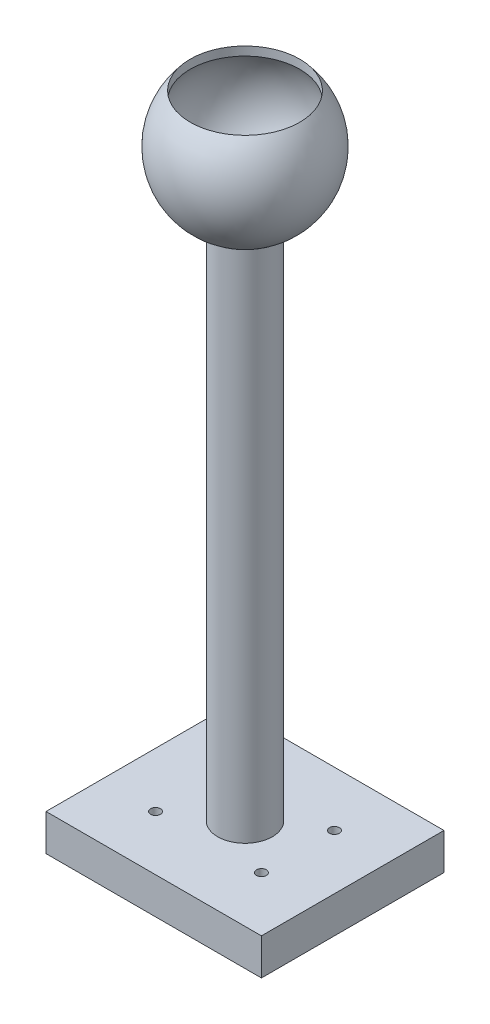
ISO-10303-21;
HEADER;
FILE_DESCRIPTION(('STEP AP214'),'2;1');
FILE_NAME('part.step','',(''),(''),'','','');
FILE_SCHEMA(('AUTOMOTIVE_DESIGN { 1 0 10303 214 1 1 1 1 }'));
ENDSEC;
DATA;
#1=APPLICATION_CONTEXT('core data for automotive mechanical design processes');
#2=APPLICATION_PROTOCOL_DEFINITION('international standard','automotive_design',2000,#1);
#3=PRODUCT_CONTEXT('',#1,'mechanical');
#4=PRODUCT('Part','Part','',(#3));
#5=PRODUCT_RELATED_PRODUCT_CATEGORY('part','',(#4));
#6=PRODUCT_DEFINITION_FORMATION('','',#4);
#7=PRODUCT_DEFINITION_CONTEXT('part definition',#1,'design');
#8=PRODUCT_DEFINITION('design','',#6,#7);
#9=PRODUCT_DEFINITION_SHAPE('','',#8);
#10=(LENGTH_UNIT() NAMED_UNIT(*) SI_UNIT(.MILLI.,.METRE.));
#11=(NAMED_UNIT(*) PLANE_ANGLE_UNIT() SI_UNIT($,.RADIAN.));
#12=(NAMED_UNIT(*) SI_UNIT($,.STERADIAN.) SOLID_ANGLE_UNIT());
#13=UNCERTAINTY_MEASURE_WITH_UNIT(LENGTH_MEASURE(1.E-05),#10,'distance_accuracy_value','');
#14=(GEOMETRIC_REPRESENTATION_CONTEXT(3) GLOBAL_UNCERTAINTY_ASSIGNED_CONTEXT((#13)) GLOBAL_UNIT_ASSIGNED_CONTEXT((#10,
#11,#12)) REPRESENTATION_CONTEXT('',''));
#15=CARTESIAN_POINT('',(0.,0.,0.));
#16=DIRECTION('',(0.,0.,1.));
#17=DIRECTION('',(1.,0.,0.));
#18=AXIS2_PLACEMENT_3D('',#15,#16,#17);
#19=CARTESIAN_POINT('',(0.,184.,0.));
#20=DIRECTION('',(0.,0.,-1.));
#21=DIRECTION('',(1.,0.,0.));
#22=AXIS2_PLACEMENT_3D('',#19,#20,#21);
#23=SPHERICAL_SURFACE('',#22,20.);
#24=CARTESIAN_POINT('',(0.,184.,0.));
#25=DIRECTION('',(0.,-1.,0.));
#26=DIRECTION('',(0.,0.,-1.));
#27=AXIS2_PLACEMENT_3D('',#24,#25,#26);
#28=SPHERICAL_SURFACE('',#27,20.);
#29=CARTESIAN_POINT('',(0.,197.228756555323,0.));
#30=DIRECTION('',(0.,-1.,0.));
#31=DIRECTION('',(0.,0.,-1.));
#32=AXIS2_PLACEMENT_3D('',#29,#30,#31);
#33=CIRCLE('',#32,15.);
#34=CARTESIAN_POINT('',(0.,197.228756555323,-15.));
#35=VERTEX_POINT('',#34);
#36=EDGE_CURVE('E11',#35,#35,#33,.F.);
#37=ORIENTED_EDGE('',*,*,#36,.F.);
#38=EDGE_LOOP('',(#37));
#39=FACE_BOUND('',#38,.T.);
#40=ADVANCED_FACE('F55',(#39),#28,.T.);
#41=CARTESIAN_POINT('',(0.,213.,0.));
#42=DIRECTION('',(0.,-1.,0.));
#43=DIRECTION('',(0.,0.,-1.));
#44=AXIS2_PLACEMENT_3D('',#41,#42,#43);
#45=CYLINDRICAL_SURFACE('',#44,15.);
#46=CARTESIAN_POINT('',(0.,194.828203913854,0.));
#47=DIRECTION('',(0.,-1.,0.));
#48=DIRECTION('',(0.,0.,-1.));
#49=AXIS2_PLACEMENT_3D('',#46,#47,#48);
#50=CIRCLE('',#49,15.);
#51=CARTESIAN_POINT('',(0.,194.828203913854,-15.));
#52=VERTEX_POINT('',#51);
#53=EDGE_CURVE('E58',#52,#52,#50,.F.);
#54=ORIENTED_EDGE('',*,*,#53,.F.);
#55=EDGE_LOOP('',(#54));
#56=FACE_BOUND('',#55,.T.);
#57=ORIENTED_EDGE('',*,*,#36,.T.);
#58=EDGE_LOOP('',(#57));
#59=FACE_BOUND('',#58,.T.);
#60=ADVANCED_FACE('F69',(#56,#59),#45,.F.);
#61=CARTESIAN_POINT('',(0.,184.,0.));
#62=DIRECTION('',(0.,0.,-1.));
#63=DIRECTION('',(1.,0.,0.));
#64=AXIS2_PLACEMENT_3D('',#61,#62,#63);
#65=SPHERICAL_SURFACE('',#64,18.5);
#66=CARTESIAN_POINT('',(0.,184.,0.));
#67=DIRECTION('',(0.,-1.,0.));
#68=DIRECTION('',(0.,0.,-1.));
#69=AXIS2_PLACEMENT_3D('',#66,#67,#68);
#70=SPHERICAL_SURFACE('',#69,18.5);
#71=ORIENTED_EDGE('',*,*,#53,.T.);
#72=EDGE_LOOP('',(#71));
#73=FACE_BOUND('',#72,.T.);
#74=ADVANCED_FACE('F67',(#73),#70,.F.);
#75=CLOSED_SHELL('',(#40,#60,#74));
#76=MANIFOLD_SOLID_BREP('B2',#75);
#77=CARTESIAN_POINT('',(29.5,24.,25.));
#78=DIRECTION('',(-1.,0.,0.));
#79=DIRECTION('',(0.,0.,1.));
#80=AXIS2_PLACEMENT_3D('',#77,#78,#79);
#81=PLANE('',#80);
#82=DIRECTION('',(0.,0.,1.));
#83=VECTOR('',#82,1.);
#84=CARTESIAN_POINT('',(29.5,14.,25.));
#85=LINE('',#84,#83);
#86=CARTESIAN_POINT('',(29.5,14.,-25.));
#87=VERTEX_POINT('',#86);
#88=CARTESIAN_POINT('',(29.5,14.,25.));
#89=VERTEX_POINT('',#88);
#90=EDGE_CURVE('E113',#87,#89,#85,.T.);
#91=ORIENTED_EDGE('',*,*,#90,.F.);
#92=DIRECTION('',(0.,-1.,0.));
#93=VECTOR('',#92,1.);
#94=CARTESIAN_POINT('',(29.5,24.,-25.));
#95=LINE('',#94,#93);
#96=CARTESIAN_POINT('',(29.5,24.,-25.));
#97=VERTEX_POINT('',#96);
#98=EDGE_CURVE('E105',#97,#87,#95,.T.);
#99=ORIENTED_EDGE('',*,*,#98,.F.);
#100=DIRECTION('',(0.,0.,-1.));
#101=VECTOR('',#100,1.);
#102=CARTESIAN_POINT('',(29.5,24.,25.));
#103=LINE('',#102,#101);
#104=CARTESIAN_POINT('',(29.5,24.,25.));
#105=VERTEX_POINT('',#104);
#106=EDGE_CURVE('E196',#105,#97,#103,.T.);
#107=ORIENTED_EDGE('',*,*,#106,.F.);
#108=DIRECTION('',(0.,-1.,0.));
#109=VECTOR('',#108,1.);
#110=CARTESIAN_POINT('',(29.5,24.,25.));
#111=LINE('',#110,#109);
#112=EDGE_CURVE('E161',#105,#89,#111,.T.);
#113=ORIENTED_EDGE('',*,*,#112,.T.);
#114=EDGE_LOOP('',(#91,#99,#107,#113));
#115=FACE_BOUND('',#114,.T.);
#116=ADVANCED_FACE('F96',(#115),#81,.F.);
#117=CARTESIAN_POINT('',(-29.5,24.,-25.));
#118=DIRECTION('',(0.,0.,1.));
#119=DIRECTION('',(1.,0.,0.));
#120=AXIS2_PLACEMENT_3D('',#117,#118,#119);
#121=PLANE('',#120);
#122=DIRECTION('',(1.,0.,0.));
#123=VECTOR('',#122,1.);
#124=CARTESIAN_POINT('',(-29.5,14.,-25.));
#125=LINE('',#124,#123);
#126=CARTESIAN_POINT('',(-29.5,14.,-25.));
#127=VERTEX_POINT('',#126);
#128=EDGE_CURVE('E157',#127,#87,#125,.T.);
#129=ORIENTED_EDGE('',*,*,#128,.F.);
#130=DIRECTION('',(0.,-1.,0.));
#131=VECTOR('',#130,1.);
#132=CARTESIAN_POINT('',(-29.5,24.,-25.));
#133=LINE('',#132,#131);
#134=CARTESIAN_POINT('',(-29.5,24.,-25.));
#135=VERTEX_POINT('',#134);
#136=EDGE_CURVE('E155',#135,#127,#133,.T.);
#137=ORIENTED_EDGE('',*,*,#136,.F.);
#138=DIRECTION('',(-1.,0.,0.));
#139=VECTOR('',#138,1.);
#140=CARTESIAN_POINT('',(-29.5,24.,-25.));
#141=LINE('',#140,#139);
#142=EDGE_CURVE('E200',#97,#135,#141,.T.);
#143=ORIENTED_EDGE('',*,*,#142,.F.);
#144=ORIENTED_EDGE('',*,*,#98,.T.);
#145=EDGE_LOOP('',(#129,#137,#143,#144));
#146=FACE_BOUND('',#145,.T.);
#147=ADVANCED_FACE('F210',(#146),#121,.F.);
#148=CARTESIAN_POINT('',(-29.5,24.,25.));
#149=DIRECTION('',(1.,0.,0.));
#150=DIRECTION('',(0.,0.,-1.));
#151=AXIS2_PLACEMENT_3D('',#148,#149,#150);
#152=PLANE('',#151);
#153=DIRECTION('',(0.,0.,-1.));
#154=VECTOR('',#153,1.);
#155=CARTESIAN_POINT('',(-29.5,14.,25.));
#156=LINE('',#155,#154);
#157=CARTESIAN_POINT('',(-29.5,14.,25.));
#158=VERTEX_POINT('',#157);
#159=EDGE_CURVE('E140',#158,#127,#156,.T.);
#160=ORIENTED_EDGE('',*,*,#159,.F.);
#161=DIRECTION('',(0.,-1.,0.));
#162=VECTOR('',#161,1.);
#163=CARTESIAN_POINT('',(-29.5,24.,25.));
#164=LINE('',#163,#162);
#165=CARTESIAN_POINT('',(-29.5,24.,25.));
#166=VERTEX_POINT('',#165);
#167=EDGE_CURVE('E153',#166,#158,#164,.T.);
#168=ORIENTED_EDGE('',*,*,#167,.F.);
#169=DIRECTION('',(0.,0.,1.));
#170=VECTOR('',#169,1.);
#171=CARTESIAN_POINT('',(-29.5,24.,25.));
#172=LINE('',#171,#170);
#173=EDGE_CURVE('E203',#135,#166,#172,.T.);
#174=ORIENTED_EDGE('',*,*,#173,.F.);
#175=ORIENTED_EDGE('',*,*,#136,.T.);
#176=EDGE_LOOP('',(#160,#168,#174,#175));
#177=FACE_BOUND('',#176,.T.);
#178=ADVANCED_FACE('F151',(#177),#152,.F.);
#179=CARTESIAN_POINT('',(-29.5,24.,25.));
#180=DIRECTION('',(0.,0.,-1.));
#181=DIRECTION('',(-1.,0.,0.));
#182=AXIS2_PLACEMENT_3D('',#179,#180,#181);
#183=PLANE('',#182);
#184=DIRECTION('',(-1.,0.,0.));
#185=VECTOR('',#184,1.);
#186=CARTESIAN_POINT('',(-29.5,14.,25.));
#187=LINE('',#186,#185);
#188=EDGE_CURVE('E137',#89,#158,#187,.T.);
#189=ORIENTED_EDGE('',*,*,#188,.F.);
#190=ORIENTED_EDGE('',*,*,#112,.F.);
#191=DIRECTION('',(1.,0.,0.));
#192=VECTOR('',#191,1.);
#193=CARTESIAN_POINT('',(-29.5,24.,25.));
#194=LINE('',#193,#192);
#195=EDGE_CURVE('E121',#166,#105,#194,.T.);
#196=ORIENTED_EDGE('',*,*,#195,.F.);
#197=ORIENTED_EDGE('',*,*,#167,.T.);
#198=EDGE_LOOP('',(#189,#190,#196,#197));
#199=FACE_BOUND('',#198,.T.);
#200=ADVANCED_FACE('F159',(#199),#183,.F.);
#201=CARTESIAN_POINT('',(-14.5,-1.00000000000004,-10.));
#202=DIRECTION('',(0.,1.,0.));
#203=DIRECTION('',(0.,0.,1.));
#204=AXIS2_PLACEMENT_3D('',#201,#202,#203);
#205=CYLINDRICAL_SURFACE('',#204,1.35);
#206=CARTESIAN_POINT('',(-14.5,24.,-10.));
#207=DIRECTION('',(0.,1.,0.));
#208=DIRECTION('',(0.,0.,1.));
#209=AXIS2_PLACEMENT_3D('',#206,#207,#208);
#210=CIRCLE('',#209,1.35);
#211=CARTESIAN_POINT('',(-14.5,24.,-8.65));
#212=VERTEX_POINT('',#211);
#213=EDGE_CURVE('E190',#212,#212,#210,.T.);
#214=ORIENTED_EDGE('',*,*,#213,.T.);
#215=EDGE_LOOP('',(#214));
#216=FACE_BOUND('',#215,.T.);
#217=CARTESIAN_POINT('',(-14.5,14.,-10.));
#218=DIRECTION('',(0.,-1.,0.));
#219=DIRECTION('',(0.,0.,-1.));
#220=AXIS2_PLACEMENT_3D('',#217,#218,#219);
#221=CIRCLE('',#220,1.35);
#222=CARTESIAN_POINT('',(-14.5,14.,-11.35));
#223=VERTEX_POINT('',#222);
#224=EDGE_CURVE('E146',#223,#223,#221,.F.);
#225=ORIENTED_EDGE('',*,*,#224,.F.);
#226=EDGE_LOOP('',(#225));
#227=FACE_BOUND('',#226,.T.);
#228=ADVANCED_FACE('F224',(#216,#227),#205,.F.);
#229=CARTESIAN_POINT('',(14.5,-1.00000000000004,-10.));
#230=DIRECTION('',(0.,1.,0.));
#231=DIRECTION('',(0.,0.,1.));
#232=AXIS2_PLACEMENT_3D('',#229,#230,#231);
#233=CYLINDRICAL_SURFACE('',#232,1.35);
#234=CARTESIAN_POINT('',(14.5,24.,-10.));
#235=DIRECTION('',(0.,1.,0.));
#236=DIRECTION('',(0.,0.,-1.));
#237=AXIS2_PLACEMENT_3D('',#234,#235,#236);
#238=CIRCLE('',#237,1.35);
#239=CARTESIAN_POINT('',(14.5,24.,-11.35));
#240=VERTEX_POINT('',#239);
#241=EDGE_CURVE('E186',#240,#240,#238,.T.);
#242=ORIENTED_EDGE('',*,*,#241,.T.);
#243=EDGE_LOOP('',(#242));
#244=FACE_BOUND('',#243,.T.);
#245=CARTESIAN_POINT('',(14.5,14.,-10.));
#246=DIRECTION('',(0.,-1.,0.));
#247=DIRECTION('',(0.,0.,-1.));
#248=AXIS2_PLACEMENT_3D('',#245,#246,#247);
#249=CIRCLE('',#248,1.35);
#250=CARTESIAN_POINT('',(14.5,14.,-11.35));
#251=VERTEX_POINT('',#250);
#252=EDGE_CURVE('E259',#251,#251,#249,.F.);
#253=ORIENTED_EDGE('',*,*,#252,.F.);
#254=EDGE_LOOP('',(#253));
#255=FACE_BOUND('',#254,.T.);
#256=ADVANCED_FACE('F236',(#244,#255),#233,.F.);
#257=CARTESIAN_POINT('',(14.5,-1.00000000000004,10.));
#258=DIRECTION('',(0.,1.,0.));
#259=DIRECTION('',(0.,0.,1.));
#260=AXIS2_PLACEMENT_3D('',#257,#258,#259);
#261=CYLINDRICAL_SURFACE('',#260,1.35);
#262=CARTESIAN_POINT('',(14.5,24.,10.));
#263=DIRECTION('',(0.,1.,0.));
#264=DIRECTION('',(0.,0.,1.));
#265=AXIS2_PLACEMENT_3D('',#262,#263,#264);
#266=CIRCLE('',#265,1.35);
#267=CARTESIAN_POINT('',(14.5,24.,11.35));
#268=VERTEX_POINT('',#267);
#269=EDGE_CURVE('E180',#268,#268,#266,.T.);
#270=ORIENTED_EDGE('',*,*,#269,.T.);
#271=EDGE_LOOP('',(#270));
#272=FACE_BOUND('',#271,.T.);
#273=CARTESIAN_POINT('',(14.5,14.,10.));
#274=DIRECTION('',(0.,-1.,0.));
#275=DIRECTION('',(0.,0.,-1.));
#276=AXIS2_PLACEMENT_3D('',#273,#274,#275);
#277=CIRCLE('',#276,1.35);
#278=CARTESIAN_POINT('',(14.5,14.,8.65));
#279=VERTEX_POINT('',#278);
#280=EDGE_CURVE('E263',#279,#279,#277,.F.);
#281=ORIENTED_EDGE('',*,*,#280,.F.);
#282=EDGE_LOOP('',(#281));
#283=FACE_BOUND('',#282,.T.);
#284=ADVANCED_FACE('F240',(#272,#283),#261,.F.);
#285=CARTESIAN_POINT('',(-14.5,-1.00000000000004,10.));
#286=DIRECTION('',(0.,1.,0.));
#287=DIRECTION('',(0.,0.,1.));
#288=AXIS2_PLACEMENT_3D('',#285,#286,#287);
#289=CYLINDRICAL_SURFACE('',#288,1.35);
#290=CARTESIAN_POINT('',(-14.5,24.,10.));
#291=DIRECTION('',(0.,1.,0.));
#292=DIRECTION('',(0.,0.,-1.));
#293=AXIS2_PLACEMENT_3D('',#290,#291,#292);
#294=CIRCLE('',#293,1.35);
#295=CARTESIAN_POINT('',(-14.5,24.,8.65));
#296=VERTEX_POINT('',#295);
#297=EDGE_CURVE('E174',#296,#296,#294,.T.);
#298=ORIENTED_EDGE('',*,*,#297,.T.);
#299=EDGE_LOOP('',(#298));
#300=FACE_BOUND('',#299,.T.);
#301=CARTESIAN_POINT('',(-14.5,14.,10.));
#302=DIRECTION('',(0.,-1.,0.));
#303=DIRECTION('',(0.,0.,-1.));
#304=AXIS2_PLACEMENT_3D('',#301,#302,#303);
#305=CIRCLE('',#304,1.35);
#306=CARTESIAN_POINT('',(-14.5,14.,8.65));
#307=VERTEX_POINT('',#306);
#308=EDGE_CURVE('E99',#307,#307,#305,.F.);
#309=ORIENTED_EDGE('',*,*,#308,.F.);
#310=EDGE_LOOP('',(#309));
#311=FACE_BOUND('',#310,.T.);
#312=ADVANCED_FACE('F232',(#300,#311),#289,.F.);
#313=CARTESIAN_POINT('',(0.,184.,0.));
#314=DIRECTION('',(0.,-1.,0.));
#315=DIRECTION('',(0.,0.,-1.));
#316=AXIS2_PLACEMENT_3D('',#313,#314,#315);
#317=CYLINDRICAL_SURFACE('',#316,7.5);
#318=CARTESIAN_POINT('',(0.,24.,0.));
#319=DIRECTION('',(0.,1.,0.));
#320=DIRECTION('',(0.,0.,1.));
#321=AXIS2_PLACEMENT_3D('',#318,#319,#320);
#322=CIRCLE('',#321,7.5);
#323=CARTESIAN_POINT('',(0.,24.,7.5));
#324=VERTEX_POINT('',#323);
#325=EDGE_CURVE('E53',#324,#324,#322,.T.);
#326=ORIENTED_EDGE('',*,*,#325,.T.);
#327=EDGE_LOOP('',(#326));
#328=FACE_BOUND('',#327,.T.);
#329=CARTESIAN_POINT('',(0.,167.088465474712,0.));
#330=DIRECTION('',(0.,1.,0.));
#331=DIRECTION('',(0.,0.,1.));
#332=AXIS2_PLACEMENT_3D('',#329,#330,#331);
#333=CIRCLE('',#332,7.5);
#334=CARTESIAN_POINT('',(0.,167.088465474712,7.5));
#335=VERTEX_POINT('',#334);
#336=EDGE_CURVE('E171',#335,#335,#333,.T.);
#337=ORIENTED_EDGE('',*,*,#336,.F.);
#338=EDGE_LOOP('',(#337));
#339=FACE_BOUND('',#338,.T.);
#340=ADVANCED_FACE('F228',(#328,#339),#317,.T.);
#341=CARTESIAN_POINT('',(0.,24.,0.));
#342=DIRECTION('',(0.,-1.,0.));
#343=DIRECTION('',(0.,0.,-1.));
#344=AXIS2_PLACEMENT_3D('',#341,#342,#343);
#345=PLANE('',#344);
#346=ORIENTED_EDGE('',*,*,#297,.F.);
#347=EDGE_LOOP('',(#346));
#348=FACE_BOUND('',#347,.T.);
#349=ORIENTED_EDGE('',*,*,#269,.F.);
#350=EDGE_LOOP('',(#349));
#351=FACE_BOUND('',#350,.T.);
#352=ORIENTED_EDGE('',*,*,#241,.F.);
#353=EDGE_LOOP('',(#352));
#354=FACE_BOUND('',#353,.T.);
#355=ORIENTED_EDGE('',*,*,#213,.F.);
#356=EDGE_LOOP('',(#355));
#357=FACE_BOUND('',#356,.T.);
#358=ORIENTED_EDGE('',*,*,#325,.F.);
#359=EDGE_LOOP('',(#358));
#360=FACE_BOUND('',#359,.T.);
#361=ORIENTED_EDGE('',*,*,#106,.T.);
#362=ORIENTED_EDGE('',*,*,#142,.T.);
#363=ORIENTED_EDGE('',*,*,#173,.T.);
#364=ORIENTED_EDGE('',*,*,#195,.T.);
#365=EDGE_LOOP('',(#361,#362,#363,#364));
#366=FACE_BOUND('',#365,.T.);
#367=ADVANCED_FACE('F206',(#348,#351,#354,#357,#360,#366),#345,.F.);
#368=CARTESIAN_POINT('',(0.,184.,0.));
#369=DIRECTION('',(0.,0.,-1.));
#370=DIRECTION('',(1.,0.,0.));
#371=AXIS2_PLACEMENT_3D('',#368,#369,#370);
#372=SPHERICAL_SURFACE('',#371,18.5);
#373=CARTESIAN_POINT('',(0.,184.,0.));
#374=DIRECTION('',(0.,1.,0.));
#375=DIRECTION('',(0.,0.,1.));
#376=AXIS2_PLACEMENT_3D('',#373,#374,#375);
#377=SPHERICAL_SURFACE('',#376,18.5);
#378=ORIENTED_EDGE('',*,*,#336,.T.);
#379=EDGE_LOOP('',(#378));
#380=FACE_BOUND('',#379,.T.);
#381=ADVANCED_FACE('F227',(#380),#377,.F.);
#382=CARTESIAN_POINT('',(-38.3352717623431,14.,40.));
#383=DIRECTION('',(0.,-1.,0.));
#384=DIRECTION('',(0.,0.,-1.));
#385=AXIS2_PLACEMENT_3D('',#382,#383,#384);
#386=PLANE('',#385);
#387=ORIENTED_EDGE('',*,*,#224,.T.);
#388=EDGE_LOOP('',(#387));
#389=FACE_BOUND('',#388,.T.);
#390=ORIENTED_EDGE('',*,*,#252,.T.);
#391=EDGE_LOOP('',(#390));
#392=FACE_BOUND('',#391,.T.);
#393=ORIENTED_EDGE('',*,*,#280,.T.);
#394=EDGE_LOOP('',(#393));
#395=FACE_BOUND('',#394,.T.);
#396=ORIENTED_EDGE('',*,*,#308,.T.);
#397=EDGE_LOOP('',(#396));
#398=FACE_BOUND('',#397,.T.);
#399=ORIENTED_EDGE('',*,*,#90,.T.);
#400=ORIENTED_EDGE('',*,*,#188,.T.);
#401=ORIENTED_EDGE('',*,*,#159,.T.);
#402=ORIENTED_EDGE('',*,*,#128,.T.);
#403=EDGE_LOOP('',(#399,#400,#401,#402));
#404=FACE_BOUND('',#403,.T.);
#405=ADVANCED_FACE('F139',(#389,#392,#395,#398,#404),#386,.T.);
#406=CLOSED_SHELL('',(#116,#147,#178,#200,#228,#256,#284,#312,#340,#367,#381,#405));
#407=MANIFOLD_SOLID_BREP('B6',#406);
#408=ADVANCED_BREP_SHAPE_REPRESENTATION('',(#18,#76,#407),#14);
#409=SHAPE_DEFINITION_REPRESENTATION(#9,#408);
ENDSEC;
END-ISO-10303-21;
